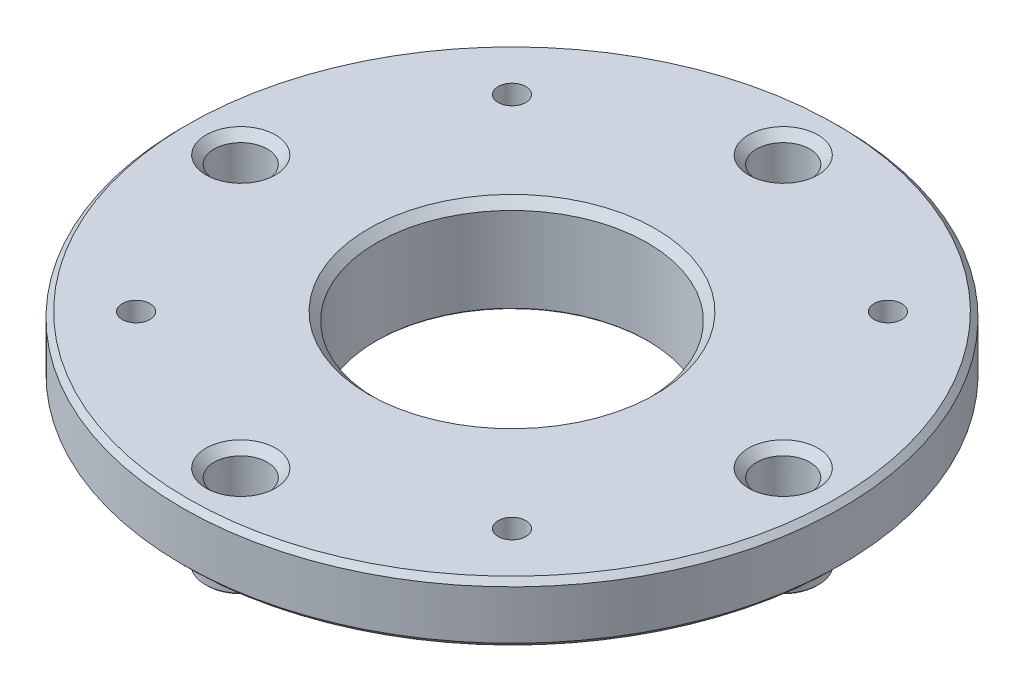
ISO-10303-21;
HEADER;
FILE_DESCRIPTION(('STEP AP214'),'2;1');
FILE_NAME('part.step','',(''),(''),'','','');
FILE_SCHEMA(('AUTOMOTIVE_DESIGN { 1 0 10303 214 1 1 1 1 }'));
ENDSEC;
DATA;
#1=APPLICATION_CONTEXT('core data for automotive mechanical design processes');
#2=APPLICATION_PROTOCOL_DEFINITION('international standard','automotive_design',2000,#1);
#3=PRODUCT_CONTEXT('',#1,'mechanical');
#4=PRODUCT('Part','Part','',(#3));
#5=PRODUCT_RELATED_PRODUCT_CATEGORY('part','',(#4));
#6=PRODUCT_DEFINITION_FORMATION('','',#4);
#7=PRODUCT_DEFINITION_CONTEXT('part definition',#1,'design');
#8=PRODUCT_DEFINITION('design','',#6,#7);
#9=PRODUCT_DEFINITION_SHAPE('','',#8);
#10=(LENGTH_UNIT() NAMED_UNIT(*) SI_UNIT(.MILLI.,.METRE.));
#11=(NAMED_UNIT(*) PLANE_ANGLE_UNIT() SI_UNIT($,.RADIAN.));
#12=(NAMED_UNIT(*) SI_UNIT($,.STERADIAN.) SOLID_ANGLE_UNIT());
#13=UNCERTAINTY_MEASURE_WITH_UNIT(LENGTH_MEASURE(1.E-05),#10,'distance_accuracy_value','');
#14=(GEOMETRIC_REPRESENTATION_CONTEXT(3) GLOBAL_UNCERTAINTY_ASSIGNED_CONTEXT((#13)) GLOBAL_UNIT_ASSIGNED_CONTEXT((#10,
#11,#12)) REPRESENTATION_CONTEXT('',''));
#15=CARTESIAN_POINT('',(0.,0.,0.));
#16=DIRECTION('',(0.,0.,1.));
#17=DIRECTION('',(1.,0.,0.));
#18=AXIS2_PLACEMENT_3D('',#15,#16,#17);
#19=CARTESIAN_POINT('',(0.,11.,0.));
#20=DIRECTION('',(0.,-1.,0.));
#21=DIRECTION('',(0.,0.,-1.));
#22=AXIS2_PLACEMENT_3D('',#19,#20,#21);
#23=CYLINDRICAL_SURFACE('',#22,60.75);
#24=CARTESIAN_POINT('',(0.,10.,0.));
#25=DIRECTION('',(0.,1.,0.));
#26=DIRECTION('',(0.,0.,1.));
#27=AXIS2_PLACEMENT_3D('',#24,#25,#26);
#28=CIRCLE('',#27,60.75);
#29=CARTESIAN_POINT('',(0.,10.,60.75));
#30=VERTEX_POINT('',#29);
#31=EDGE_CURVE('E110',#30,#30,#28,.F.);
#32=ORIENTED_EDGE('',*,*,#31,.T.);
#33=EDGE_LOOP('',(#32));
#34=FACE_BOUND('',#33,.T.);
#35=CARTESIAN_POINT('',(0.,0.999999999999994,0.));
#36=DIRECTION('',(0.,-1.,0.));
#37=DIRECTION('',(0.,0.,-1.));
#38=AXIS2_PLACEMENT_3D('',#35,#36,#37);
#39=CIRCLE('',#38,60.75);
#40=CARTESIAN_POINT('',(0.,0.999999999999994,-60.75));
#41=VERTEX_POINT('',#40);
#42=EDGE_CURVE('E114',#41,#41,#39,.F.);
#43=ORIENTED_EDGE('',*,*,#42,.T.);
#44=EDGE_LOOP('',(#43));
#45=FACE_BOUND('',#44,.T.);
#46=ADVANCED_FACE('F45',(#34,#45),#23,.T.);
#47=CARTESIAN_POINT('',(60.75,11.,0.));
#48=DIRECTION('',(0.,1.,0.));
#49=DIRECTION('',(0.,0.,1.));
#50=AXIS2_PLACEMENT_3D('',#47,#48,#49);
#51=PLANE('',#50);
#52=CARTESIAN_POINT('',(0.,11.,-50.));
#53=DIRECTION('',(0.,1.,0.));
#54=DIRECTION('',(0.,0.,1.));
#55=AXIS2_PLACEMENT_3D('',#52,#53,#54);
#56=CIRCLE('',#55,6.40219999999998);
#57=CARTESIAN_POINT('',(0.,11.,-43.5978));
#58=VERTEX_POINT('',#57);
#59=EDGE_CURVE('E74',#58,#58,#56,.F.);
#60=ORIENTED_EDGE('',*,*,#59,.T.);
#61=EDGE_LOOP('',(#60));
#62=FACE_BOUND('',#61,.T.);
#63=CARTESIAN_POINT('',(50.,11.,0.));
#64=DIRECTION('',(0.,1.,0.));
#65=DIRECTION('',(0.,0.,1.));
#66=AXIS2_PLACEMENT_3D('',#63,#64,#65);
#67=CIRCLE('',#66,6.40220000000002);
#68=CARTESIAN_POINT('',(50.,11.,6.40220000000002));
#69=VERTEX_POINT('',#68);
#70=EDGE_CURVE('E78',#69,#69,#67,.F.);
#71=ORIENTED_EDGE('',*,*,#70,.T.);
#72=EDGE_LOOP('',(#71));
#73=FACE_BOUND('',#72,.T.);
#74=CARTESIAN_POINT('',(0.,11.,0.));
#75=DIRECTION('',(0.,1.,0.));
#76=DIRECTION('',(0.,0.,1.));
#77=AXIS2_PLACEMENT_3D('',#74,#75,#76);
#78=CIRCLE('',#77,26.4555);
#79=CARTESIAN_POINT('',(0.,11.,26.4555));
#80=VERTEX_POINT('',#79);
#81=EDGE_CURVE('E82',#80,#80,#78,.F.);
#82=ORIENTED_EDGE('',*,*,#81,.T.);
#83=EDGE_LOOP('',(#82));
#84=FACE_BOUND('',#83,.T.);
#85=CARTESIAN_POINT('',(0.,11.,50.));
#86=DIRECTION('',(0.,1.,0.));
#87=DIRECTION('',(0.,0.,1.));
#88=AXIS2_PLACEMENT_3D('',#85,#86,#87);
#89=CIRCLE('',#88,6.40219999999994);
#90=CARTESIAN_POINT('',(0.,11.,56.4021999999999));
#91=VERTEX_POINT('',#90);
#92=EDGE_CURVE('E86',#91,#91,#89,.F.);
#93=ORIENTED_EDGE('',*,*,#92,.T.);
#94=EDGE_LOOP('',(#93));
#95=FACE_BOUND('',#94,.T.);
#96=CARTESIAN_POINT('',(-50.,11.,0.));
#97=DIRECTION('',(0.,1.,0.));
#98=DIRECTION('',(0.,0.,1.));
#99=AXIS2_PLACEMENT_3D('',#96,#97,#98);
#100=CIRCLE('',#99,6.40219999999994);
#101=CARTESIAN_POINT('',(-50.,11.,6.40219999999995));
#102=VERTEX_POINT('',#101);
#103=EDGE_CURVE('E90',#102,#102,#100,.F.);
#104=ORIENTED_EDGE('',*,*,#103,.T.);
#105=EDGE_LOOP('',(#104));
#106=FACE_BOUND('',#105,.T.);
#107=CARTESIAN_POINT('',(0.,11.,0.));
#108=DIRECTION('',(0.,1.,0.));
#109=DIRECTION('',(0.,0.,1.));
#110=AXIS2_PLACEMENT_3D('',#107,#108,#109);
#111=CIRCLE('',#110,59.75);
#112=CARTESIAN_POINT('',(0.,11.,59.75));
#113=VERTEX_POINT('',#112);
#114=EDGE_CURVE('E106',#113,#113,#111,.T.);
#115=ORIENTED_EDGE('',*,*,#114,.T.);
#116=EDGE_LOOP('',(#115));
#117=FACE_BOUND('',#116,.T.);
#118=CARTESIAN_POINT('',(-34.6482322781409,11.,34.6482322781407));
#119=DIRECTION('',(0.,1.,0.));
#120=DIRECTION('',(0.,0.,1.));
#121=AXIS2_PLACEMENT_3D('',#118,#119,#120);
#122=CIRCLE('',#121,2.55270000000001);
#123=CARTESIAN_POINT('',(-34.6482322781409,11.,37.2009322781408));
#124=VERTEX_POINT('',#123);
#125=EDGE_CURVE('E196',#124,#124,#122,.T.);
#126=ORIENTED_EDGE('',*,*,#125,.F.);
#127=EDGE_LOOP('',(#126));
#128=FACE_BOUND('',#127,.T.);
#129=CARTESIAN_POINT('',(34.6482322781407,11.,34.6482322781409));
#130=DIRECTION('',(0.,1.,0.));
#131=DIRECTION('',(0.,0.,1.));
#132=AXIS2_PLACEMENT_3D('',#129,#130,#131);
#133=CIRCLE('',#132,2.55270000000001);
#134=CARTESIAN_POINT('',(34.6482322781407,11.,37.2009322781409));
#135=VERTEX_POINT('',#134);
#136=EDGE_CURVE('E195',#135,#135,#133,.T.);
#137=ORIENTED_EDGE('',*,*,#136,.F.);
#138=EDGE_LOOP('',(#137));
#139=FACE_BOUND('',#138,.T.);
#140=CARTESIAN_POINT('',(34.6482322781409,11.,-34.6482322781407));
#141=DIRECTION('',(0.,1.,0.));
#142=DIRECTION('',(0.,0.,1.));
#143=AXIS2_PLACEMENT_3D('',#140,#141,#142);
#144=CIRCLE('',#143,2.55270000000001);
#145=CARTESIAN_POINT('',(34.6482322781409,11.,-32.0955322781407));
#146=VERTEX_POINT('',#145);
#147=EDGE_CURVE('E201',#146,#146,#144,.T.);
#148=ORIENTED_EDGE('',*,*,#147,.F.);
#149=EDGE_LOOP('',(#148));
#150=FACE_BOUND('',#149,.T.);
#151=CARTESIAN_POINT('',(-34.6482322781407,11.,-34.6482322781409));
#152=DIRECTION('',(0.,1.,0.));
#153=DIRECTION('',(0.,0.,1.));
#154=AXIS2_PLACEMENT_3D('',#151,#152,#153);
#155=CIRCLE('',#154,2.55270000000001);
#156=CARTESIAN_POINT('',(-34.6482322781407,11.,-32.0955322781409));
#157=VERTEX_POINT('',#156);
#158=EDGE_CURVE('E206',#157,#157,#155,.T.);
#159=ORIENTED_EDGE('',*,*,#158,.F.);
#160=EDGE_LOOP('',(#159));
#161=FACE_BOUND('',#160,.T.);
#162=ADVANCED_FACE('F245',(#62,#73,#84,#95,#106,#117,#128,#139,#150,#161),#51,.T.);
#163=CARTESIAN_POINT('',(0.,0.,0.));
#164=DIRECTION('',(0.,-1.,0.));
#165=DIRECTION('',(0.,0.,-1.));
#166=AXIS2_PLACEMENT_3D('',#163,#164,#165);
#167=PLANE('',#166);
#168=CARTESIAN_POINT('',(0.,0.,0.));
#169=DIRECTION('',(0.,-1.,0.));
#170=DIRECTION('',(0.,0.,-1.));
#171=AXIS2_PLACEMENT_3D('',#168,#169,#170);
#172=CIRCLE('',#171,59.75);
#173=CARTESIAN_POINT('',(0.,0.,-59.75));
#174=VERTEX_POINT('',#173);
#175=EDGE_CURVE('E102',#174,#174,#172,.T.);
#176=ORIENTED_EDGE('',*,*,#175,.T.);
#177=EDGE_LOOP('',(#176));
#178=FACE_BOUND('',#177,.T.);
#179=CARTESIAN_POINT('',(-34.6482322781409,0.,34.6482322781407));
#180=DIRECTION('',(0.,-1.,0.));
#181=DIRECTION('',(0.,0.,-1.));
#182=AXIS2_PLACEMENT_3D('',#179,#180,#181);
#183=CIRCLE('',#182,2.55270000000001);
#184=CARTESIAN_POINT('',(-34.6482322781409,0.,32.0955322781407));
#185=VERTEX_POINT('',#184);
#186=EDGE_CURVE('E191',#185,#185,#183,.T.);
#187=ORIENTED_EDGE('',*,*,#186,.F.);
#188=EDGE_LOOP('',(#187));
#189=FACE_BOUND('',#188,.T.);
#190=CARTESIAN_POINT('',(34.6482322781407,0.,34.6482322781409));
#191=DIRECTION('',(0.,-1.,0.));
#192=DIRECTION('',(0.,0.,-1.));
#193=AXIS2_PLACEMENT_3D('',#190,#191,#192);
#194=CIRCLE('',#193,2.55270000000001);
#195=CARTESIAN_POINT('',(34.6482322781407,0.,32.0955322781409));
#196=VERTEX_POINT('',#195);
#197=EDGE_CURVE('E197',#196,#196,#194,.T.);
#198=ORIENTED_EDGE('',*,*,#197,.F.);
#199=EDGE_LOOP('',(#198));
#200=FACE_BOUND('',#199,.T.);
#201=CARTESIAN_POINT('',(34.6482322781409,0.,-34.6482322781407));
#202=DIRECTION('',(0.,-1.,0.));
#203=DIRECTION('',(0.,0.,-1.));
#204=AXIS2_PLACEMENT_3D('',#201,#202,#203);
#205=CIRCLE('',#204,2.55270000000001);
#206=CARTESIAN_POINT('',(34.6482322781409,0.,-37.2009322781408));
#207=VERTEX_POINT('',#206);
#208=EDGE_CURVE('E202',#207,#207,#205,.T.);
#209=ORIENTED_EDGE('',*,*,#208,.F.);
#210=EDGE_LOOP('',(#209));
#211=FACE_BOUND('',#210,.T.);
#212=CARTESIAN_POINT('',(-34.6482322781407,0.,-34.6482322781409));
#213=DIRECTION('',(0.,-1.,0.));
#214=DIRECTION('',(0.,0.,-1.));
#215=AXIS2_PLACEMENT_3D('',#212,#213,#214);
#216=CIRCLE('',#215,2.55270000000001);
#217=CARTESIAN_POINT('',(-34.6482322781407,0.,-37.2009322781409));
#218=VERTEX_POINT('',#217);
#219=EDGE_CURVE('E226',#218,#218,#216,.T.);
#220=ORIENTED_EDGE('',*,*,#219,.F.);
#221=EDGE_LOOP('',(#220));
#222=FACE_BOUND('',#221,.T.);
#223=CARTESIAN_POINT('',(0.,0.,50.));
#224=DIRECTION('',(0.,-1.,0.));
#225=DIRECTION('',(0.,0.,-1.));
#226=AXIS2_PLACEMENT_3D('',#223,#224,#225);
#227=CIRCLE('',#226,6.475);
#228=CARTESIAN_POINT('',(0.,0.,43.525));
#229=VERTEX_POINT('',#228);
#230=EDGE_CURVE('E190',#229,#229,#227,.T.);
#231=ORIENTED_EDGE('',*,*,#230,.F.);
#232=EDGE_LOOP('',(#231));
#233=FACE_BOUND('',#232,.T.);
#234=CARTESIAN_POINT('',(50.,0.,0.));
#235=DIRECTION('',(0.,-1.,0.));
#236=DIRECTION('',(0.,0.,-1.));
#237=AXIS2_PLACEMENT_3D('',#234,#235,#236);
#238=CIRCLE('',#237,6.475);
#239=CARTESIAN_POINT('',(50.,0.,-6.475));
#240=VERTEX_POINT('',#239);
#241=EDGE_CURVE('E210',#240,#240,#238,.T.);
#242=ORIENTED_EDGE('',*,*,#241,.F.);
#243=EDGE_LOOP('',(#242));
#244=FACE_BOUND('',#243,.T.);
#245=CARTESIAN_POINT('',(0.,0.,-50.));
#246=DIRECTION('',(0.,-1.,0.));
#247=DIRECTION('',(0.,0.,-1.));
#248=AXIS2_PLACEMENT_3D('',#245,#246,#247);
#249=CIRCLE('',#248,6.475);
#250=CARTESIAN_POINT('',(0.,0.,-56.475));
#251=VERTEX_POINT('',#250);
#252=EDGE_CURVE('E214',#251,#251,#249,.T.);
#253=ORIENTED_EDGE('',*,*,#252,.F.);
#254=EDGE_LOOP('',(#253));
#255=FACE_BOUND('',#254,.T.);
#256=CARTESIAN_POINT('',(-50.,0.,0.));
#257=DIRECTION('',(0.,-1.,0.));
#258=DIRECTION('',(0.,0.,-1.));
#259=AXIS2_PLACEMENT_3D('',#256,#257,#258);
#260=CIRCLE('',#259,6.475);
#261=CARTESIAN_POINT('',(-50.,0.,-6.475));
#262=VERTEX_POINT('',#261);
#263=EDGE_CURVE('E218',#262,#262,#260,.T.);
#264=ORIENTED_EDGE('',*,*,#263,.F.);
#265=EDGE_LOOP('',(#264));
#266=FACE_BOUND('',#265,.T.);
#267=CARTESIAN_POINT('',(0.,0.,0.));
#268=DIRECTION('',(0.,-1.,0.));
#269=DIRECTION('',(0.,0.,-1.));
#270=AXIS2_PLACEMENT_3D('',#267,#268,#269);
#271=CIRCLE('',#270,28.485);
#272=CARTESIAN_POINT('',(0.,0.,-28.485));
#273=VERTEX_POINT('',#272);
#274=EDGE_CURVE('E222',#273,#273,#271,.T.);
#275=ORIENTED_EDGE('',*,*,#274,.F.);
#276=EDGE_LOOP('',(#275));
#277=FACE_BOUND('',#276,.T.);
#278=ADVANCED_FACE('F248',(#178,#189,#200,#211,#222,#233,#244,#255,#266,#277),#167,.T.);
#279=CARTESIAN_POINT('',(0.,-6.35,0.));
#280=DIRECTION('',(0.,1.,0.));
#281=DIRECTION('',(0.,0.,1.));
#282=AXIS2_PLACEMENT_3D('',#279,#280,#281);
#283=CYLINDRICAL_SURFACE('',#282,28.485);
#284=CARTESIAN_POINT('',(0.,-5.34999999999997,0.));
#285=DIRECTION('',(0.,-1.,0.));
#286=DIRECTION('',(0.,0.,-1.));
#287=AXIS2_PLACEMENT_3D('',#284,#285,#286);
#288=CIRCLE('',#287,28.485);
#289=CARTESIAN_POINT('',(0.,-5.34999999999997,-28.485));
#290=VERTEX_POINT('',#289);
#291=EDGE_CURVE('E94',#290,#290,#288,.F.);
#292=ORIENTED_EDGE('',*,*,#291,.T.);
#293=EDGE_LOOP('',(#292));
#294=FACE_BOUND('',#293,.T.);
#295=ORIENTED_EDGE('',*,*,#274,.T.);
#296=EDGE_LOOP('',(#295));
#297=FACE_BOUND('',#296,.T.);
#298=ADVANCED_FACE('F664',(#294,#297),#283,.T.);
#299=CARTESIAN_POINT('',(0.,-6.35,0.));
#300=DIRECTION('',(0.,-1.,0.));
#301=DIRECTION('',(0.,0.,-1.));
#302=AXIS2_PLACEMENT_3D('',#299,#300,#301);
#303=PLANE('',#302);
#304=CARTESIAN_POINT('',(0.,-6.35,0.));
#305=DIRECTION('',(0.,-1.,0.));
#306=DIRECTION('',(0.,0.,-1.));
#307=AXIS2_PLACEMENT_3D('',#304,#305,#306);
#308=CIRCLE('',#307,27.485);
#309=CARTESIAN_POINT('',(0.,-6.35,-27.485));
#310=VERTEX_POINT('',#309);
#311=EDGE_CURVE('E98',#310,#310,#308,.T.);
#312=ORIENTED_EDGE('',*,*,#311,.T.);
#313=EDGE_LOOP('',(#312));
#314=FACE_BOUND('',#313,.T.);
#315=CARTESIAN_POINT('',(0.,-6.35,0.));
#316=DIRECTION('',(0.,-1.,0.));
#317=DIRECTION('',(0.,0.,-1.));
#318=AXIS2_PLACEMENT_3D('',#315,#316,#317);
#319=CIRCLE('',#318,25.2055);
#320=CARTESIAN_POINT('',(0.,-6.35,-25.2055));
#321=VERTEX_POINT('',#320);
#322=EDGE_CURVE('E186',#321,#321,#319,.F.);
#323=ORIENTED_EDGE('',*,*,#322,.T.);
#324=EDGE_LOOP('',(#323));
#325=FACE_BOUND('',#324,.T.);
#326=ADVANCED_FACE('F655',(#314,#325),#303,.T.);
#327=CARTESIAN_POINT('',(-50.,-4.65,0.));
#328=DIRECTION('',(0.,1.,0.));
#329=DIRECTION('',(0.,0.,1.));
#330=AXIS2_PLACEMENT_3D('',#327,#328,#329);
#331=CYLINDRICAL_SURFACE('',#330,6.475);
#332=CARTESIAN_POINT('',(-50.,-4.40000000000001,0.));
#333=DIRECTION('',(0.,-1.,0.));
#334=DIRECTION('',(0.,0.,-1.));
#335=AXIS2_PLACEMENT_3D('',#332,#333,#334);
#336=CIRCLE('',#335,6.475);
#337=CARTESIAN_POINT('',(-50.,-4.40000000000001,-6.475));
#338=VERTEX_POINT('',#337);
#339=EDGE_CURVE('E142',#338,#338,#336,.F.);
#340=ORIENTED_EDGE('',*,*,#339,.T.);
#341=EDGE_LOOP('',(#340));
#342=FACE_BOUND('',#341,.T.);
#343=ORIENTED_EDGE('',*,*,#263,.T.);
#344=EDGE_LOOP('',(#343));
#345=FACE_BOUND('',#344,.T.);
#346=ADVANCED_FACE('F646',(#342,#345),#331,.T.);
#347=CARTESIAN_POINT('',(-43.525,-4.65,0.));
#348=DIRECTION('',(0.,-1.,0.));
#349=DIRECTION('',(0.,0.,-1.));
#350=AXIS2_PLACEMENT_3D('',#347,#348,#349);
#351=PLANE('',#350);
#352=CARTESIAN_POINT('',(-50.,-4.65,0.));
#353=DIRECTION('',(0.,-1.,0.));
#354=DIRECTION('',(0.,0.,-1.));
#355=AXIS2_PLACEMENT_3D('',#352,#353,#354);
#356=CIRCLE('',#355,5.15220000000001);
#357=CARTESIAN_POINT('',(-50.,-4.65,-5.1522));
#358=VERTEX_POINT('',#357);
#359=EDGE_CURVE('E158',#358,#358,#356,.F.);
#360=ORIENTED_EDGE('',*,*,#359,.T.);
#361=EDGE_LOOP('',(#360));
#362=FACE_BOUND('',#361,.T.);
#363=CARTESIAN_POINT('',(-50.,-4.65,0.));
#364=DIRECTION('',(0.,-1.,0.));
#365=DIRECTION('',(0.,0.,-1.));
#366=AXIS2_PLACEMENT_3D('',#363,#364,#365);
#367=CIRCLE('',#366,6.22499999999998);
#368=CARTESIAN_POINT('',(-50.,-4.65,-6.22499999999998));
#369=VERTEX_POINT('',#368);
#370=EDGE_CURVE('E162',#369,#369,#367,.T.);
#371=ORIENTED_EDGE('',*,*,#370,.T.);
#372=EDGE_LOOP('',(#371));
#373=FACE_BOUND('',#372,.T.);
#374=ADVANCED_FACE('F636',(#362,#373),#351,.T.);
#375=CARTESIAN_POINT('',(0.,-4.65,-50.));
#376=DIRECTION('',(0.,1.,0.));
#377=DIRECTION('',(0.,0.,1.));
#378=AXIS2_PLACEMENT_3D('',#375,#376,#377);
#379=CYLINDRICAL_SURFACE('',#378,6.475);
#380=CARTESIAN_POINT('',(0.,-4.40000000000002,-50.));
#381=DIRECTION('',(0.,-1.,0.));
#382=DIRECTION('',(0.,0.,-1.));
#383=AXIS2_PLACEMENT_3D('',#380,#381,#382);
#384=CIRCLE('',#383,6.475);
#385=CARTESIAN_POINT('',(0.,-4.40000000000002,-56.475));
#386=VERTEX_POINT('',#385);
#387=EDGE_CURVE('E118',#386,#386,#384,.F.);
#388=ORIENTED_EDGE('',*,*,#387,.T.);
#389=EDGE_LOOP('',(#388));
#390=FACE_BOUND('',#389,.T.);
#391=ORIENTED_EDGE('',*,*,#252,.T.);
#392=EDGE_LOOP('',(#391));
#393=FACE_BOUND('',#392,.T.);
#394=ADVANCED_FACE('F626',(#390,#393),#379,.T.);
#395=CARTESIAN_POINT('',(6.475,-4.65,-50.));
#396=DIRECTION('',(0.,-1.,0.));
#397=DIRECTION('',(0.,0.,-1.));
#398=AXIS2_PLACEMENT_3D('',#395,#396,#397);
#399=PLANE('',#398);
#400=CARTESIAN_POINT('',(0.,-4.65,-50.));
#401=DIRECTION('',(0.,-1.,0.));
#402=DIRECTION('',(0.,0.,-1.));
#403=AXIS2_PLACEMENT_3D('',#400,#401,#402);
#404=CIRCLE('',#403,5.15219999999998);
#405=CARTESIAN_POINT('',(0.,-4.65,-55.1522));
#406=VERTEX_POINT('',#405);
#407=EDGE_CURVE('E122',#406,#406,#404,.F.);
#408=ORIENTED_EDGE('',*,*,#407,.T.);
#409=EDGE_LOOP('',(#408));
#410=FACE_BOUND('',#409,.T.);
#411=CARTESIAN_POINT('',(0.,-4.65,-50.));
#412=DIRECTION('',(0.,-1.,0.));
#413=DIRECTION('',(0.,0.,-1.));
#414=AXIS2_PLACEMENT_3D('',#411,#412,#413);
#415=CIRCLE('',#414,6.22499999999999);
#416=CARTESIAN_POINT('',(0.,-4.65,-56.225));
#417=VERTEX_POINT('',#416);
#418=EDGE_CURVE('E126',#417,#417,#415,.T.);
#419=ORIENTED_EDGE('',*,*,#418,.T.);
#420=EDGE_LOOP('',(#419));
#421=FACE_BOUND('',#420,.T.);
#422=ADVANCED_FACE('F616',(#410,#421),#399,.T.);
#423=CARTESIAN_POINT('',(50.,-4.65,0.));
#424=DIRECTION('',(0.,1.,0.));
#425=DIRECTION('',(0.,0.,1.));
#426=AXIS2_PLACEMENT_3D('',#423,#424,#425);
#427=CYLINDRICAL_SURFACE('',#426,6.475);
#428=CARTESIAN_POINT('',(50.,-4.40000000000001,0.));
#429=DIRECTION('',(0.,-1.,0.));
#430=DIRECTION('',(0.,0.,-1.));
#431=AXIS2_PLACEMENT_3D('',#428,#429,#430);
#432=CIRCLE('',#431,6.475);
#433=CARTESIAN_POINT('',(50.,-4.40000000000001,-6.475));
#434=VERTEX_POINT('',#433);
#435=EDGE_CURVE('E134',#434,#434,#432,.F.);
#436=ORIENTED_EDGE('',*,*,#435,.T.);
#437=EDGE_LOOP('',(#436));
#438=FACE_BOUND('',#437,.T.);
#439=ORIENTED_EDGE('',*,*,#241,.T.);
#440=EDGE_LOOP('',(#439));
#441=FACE_BOUND('',#440,.T.);
#442=ADVANCED_FACE('F606',(#438,#441),#427,.T.);
#443=CARTESIAN_POINT('',(56.475,-4.65,0.));
#444=DIRECTION('',(0.,-1.,0.));
#445=DIRECTION('',(0.,0.,-1.));
#446=AXIS2_PLACEMENT_3D('',#443,#444,#445);
#447=PLANE('',#446);
#448=CARTESIAN_POINT('',(50.,-4.65,0.));
#449=DIRECTION('',(0.,-1.,0.));
#450=DIRECTION('',(0.,0.,-1.));
#451=AXIS2_PLACEMENT_3D('',#448,#449,#450);
#452=CIRCLE('',#451,5.15219999999998);
#453=CARTESIAN_POINT('',(50.,-4.65,-5.15219999999999));
#454=VERTEX_POINT('',#453);
#455=EDGE_CURVE('E146',#454,#454,#452,.F.);
#456=ORIENTED_EDGE('',*,*,#455,.T.);
#457=EDGE_LOOP('',(#456));
#458=FACE_BOUND('',#457,.T.);
#459=CARTESIAN_POINT('',(50.,-4.65,0.));
#460=DIRECTION('',(0.,-1.,0.));
#461=DIRECTION('',(0.,0.,-1.));
#462=AXIS2_PLACEMENT_3D('',#459,#460,#461);
#463=CIRCLE('',#462,6.22499999999998);
#464=CARTESIAN_POINT('',(50.,-4.65,-6.22499999999998));
#465=VERTEX_POINT('',#464);
#466=EDGE_CURVE('E150',#465,#465,#463,.T.);
#467=ORIENTED_EDGE('',*,*,#466,.T.);
#468=EDGE_LOOP('',(#467));
#469=FACE_BOUND('',#468,.T.);
#470=ADVANCED_FACE('F596',(#458,#469),#447,.T.);
#471=CARTESIAN_POINT('',(0.,-4.65,50.));
#472=DIRECTION('',(0.,1.,0.));
#473=DIRECTION('',(0.,0.,1.));
#474=AXIS2_PLACEMENT_3D('',#471,#472,#473);
#475=CYLINDRICAL_SURFACE('',#474,6.475);
#476=CARTESIAN_POINT('',(0.,-4.40000000000002,50.));
#477=DIRECTION('',(0.,-1.,0.));
#478=DIRECTION('',(0.,0.,-1.));
#479=AXIS2_PLACEMENT_3D('',#476,#477,#478);
#480=CIRCLE('',#479,6.475);
#481=CARTESIAN_POINT('',(0.,-4.40000000000002,43.525));
#482=VERTEX_POINT('',#481);
#483=EDGE_CURVE('E138',#482,#482,#480,.F.);
#484=ORIENTED_EDGE('',*,*,#483,.T.);
#485=EDGE_LOOP('',(#484));
#486=FACE_BOUND('',#485,.T.);
#487=ORIENTED_EDGE('',*,*,#230,.T.);
#488=EDGE_LOOP('',(#487));
#489=FACE_BOUND('',#488,.T.);
#490=ADVANCED_FACE('F270',(#486,#489),#475,.T.);
#491=CARTESIAN_POINT('',(6.47500000000001,-4.65,50.));
#492=DIRECTION('',(0.,-1.,0.));
#493=DIRECTION('',(0.,0.,-1.));
#494=AXIS2_PLACEMENT_3D('',#491,#492,#493);
#495=PLANE('',#494);
#496=CARTESIAN_POINT('',(0.,-4.65,50.));
#497=DIRECTION('',(0.,-1.,0.));
#498=DIRECTION('',(0.,0.,-1.));
#499=AXIS2_PLACEMENT_3D('',#496,#497,#498);
#500=CIRCLE('',#499,5.15219999999998);
#501=CARTESIAN_POINT('',(0.,-4.65,44.8478));
#502=VERTEX_POINT('',#501);
#503=EDGE_CURVE('E170',#502,#502,#500,.F.);
#504=ORIENTED_EDGE('',*,*,#503,.T.);
#505=EDGE_LOOP('',(#504));
#506=FACE_BOUND('',#505,.T.);
#507=CARTESIAN_POINT('',(0.,-4.65,50.));
#508=DIRECTION('',(0.,-1.,0.));
#509=DIRECTION('',(0.,0.,-1.));
#510=AXIS2_PLACEMENT_3D('',#507,#508,#509);
#511=CIRCLE('',#510,6.22499999999999);
#512=CARTESIAN_POINT('',(0.,-4.65,43.775));
#513=VERTEX_POINT('',#512);
#514=EDGE_CURVE('E174',#513,#513,#511,.T.);
#515=ORIENTED_EDGE('',*,*,#514,.T.);
#516=EDGE_LOOP('',(#515));
#517=FACE_BOUND('',#516,.T.);
#518=ADVANCED_FACE('F260',(#506,#517),#495,.T.);
#519=CARTESIAN_POINT('',(-34.6482322781407,11.,-34.6482322781409));
#520=DIRECTION('',(0.,1.,0.));
#521=DIRECTION('',(0.,0.,1.));
#522=AXIS2_PLACEMENT_3D('',#519,#520,#521);
#523=CYLINDRICAL_SURFACE('',#522,2.55270000000001);
#524=ORIENTED_EDGE('',*,*,#219,.T.);
#525=EDGE_LOOP('',(#524));
#526=FACE_BOUND('',#525,.T.);
#527=ORIENTED_EDGE('',*,*,#158,.T.);
#528=EDGE_LOOP('',(#527));
#529=FACE_BOUND('',#528,.T.);
#530=ADVANCED_FACE('F257',(#526,#529),#523,.F.);
#531=CARTESIAN_POINT('',(34.6482322781409,11.,-34.6482322781407));
#532=DIRECTION('',(0.,1.,0.));
#533=DIRECTION('',(0.,0.,1.));
#534=AXIS2_PLACEMENT_3D('',#531,#532,#533);
#535=CYLINDRICAL_SURFACE('',#534,2.55270000000001);
#536=ORIENTED_EDGE('',*,*,#208,.T.);
#537=EDGE_LOOP('',(#536));
#538=FACE_BOUND('',#537,.T.);
#539=ORIENTED_EDGE('',*,*,#147,.T.);
#540=EDGE_LOOP('',(#539));
#541=FACE_BOUND('',#540,.T.);
#542=ADVANCED_FACE('F259',(#538,#541),#535,.F.);
#543=CARTESIAN_POINT('',(34.6482322781407,11.,34.6482322781409));
#544=DIRECTION('',(0.,1.,0.));
#545=DIRECTION('',(0.,0.,1.));
#546=AXIS2_PLACEMENT_3D('',#543,#544,#545);
#547=CYLINDRICAL_SURFACE('',#546,2.55270000000001);
#548=ORIENTED_EDGE('',*,*,#197,.T.);
#549=EDGE_LOOP('',(#548));
#550=FACE_BOUND('',#549,.T.);
#551=ORIENTED_EDGE('',*,*,#136,.T.);
#552=EDGE_LOOP('',(#551));
#553=FACE_BOUND('',#552,.T.);
#554=ADVANCED_FACE('F266',(#550,#553),#547,.F.);
#555=CARTESIAN_POINT('',(-34.6482322781409,11.,34.6482322781407));
#556=DIRECTION('',(0.,1.,0.));
#557=DIRECTION('',(0.,0.,1.));
#558=AXIS2_PLACEMENT_3D('',#555,#556,#557);
#559=CYLINDRICAL_SURFACE('',#558,2.55270000000001);
#560=ORIENTED_EDGE('',*,*,#186,.T.);
#561=EDGE_LOOP('',(#560));
#562=FACE_BOUND('',#561,.T.);
#563=ORIENTED_EDGE('',*,*,#125,.T.);
#564=EDGE_LOOP('',(#563));
#565=FACE_BOUND('',#564,.T.);
#566=ADVANCED_FACE('F243',(#562,#565),#559,.F.);
#567=CARTESIAN_POINT('',(-50.,11.,0.));
#568=DIRECTION('',(0.,1.,0.));
#569=DIRECTION('',(0.,0.,1.));
#570=AXIS2_PLACEMENT_3D('',#567,#568,#569);
#571=CYLINDRICAL_SURFACE('',#570,4.90219999999999);
#572=CARTESIAN_POINT('',(-50.,9.50000000000006,0.));
#573=DIRECTION('',(0.,1.,0.));
#574=DIRECTION('',(0.,0.,1.));
#575=AXIS2_PLACEMENT_3D('',#572,#573,#574);
#576=CIRCLE('',#575,4.90219999999999);
#577=CARTESIAN_POINT('',(-50.,9.50000000000006,4.9022));
#578=VERTEX_POINT('',#577);
#579=EDGE_CURVE('E10',#578,#578,#576,.T.);
#580=ORIENTED_EDGE('',*,*,#579,.T.);
#581=EDGE_LOOP('',(#580));
#582=FACE_BOUND('',#581,.T.);
#583=CARTESIAN_POINT('',(-50.,-4.40000000000001,0.));
#584=DIRECTION('',(0.,-1.,0.));
#585=DIRECTION('',(0.,0.,-1.));
#586=AXIS2_PLACEMENT_3D('',#583,#584,#585);
#587=CIRCLE('',#586,4.90219999999999);
#588=CARTESIAN_POINT('',(-50.,-4.40000000000001,-4.90219999999998));
#589=VERTEX_POINT('',#588);
#590=EDGE_CURVE('E166',#589,#589,#587,.T.);
#591=ORIENTED_EDGE('',*,*,#590,.T.);
#592=EDGE_LOOP('',(#591));
#593=FACE_BOUND('',#592,.T.);
#594=ADVANCED_FACE('F544',(#582,#593),#571,.F.);
#595=CARTESIAN_POINT('',(0.,11.,50.));
#596=DIRECTION('',(0.,1.,0.));
#597=DIRECTION('',(0.,0.,1.));
#598=AXIS2_PLACEMENT_3D('',#595,#596,#597);
#599=CYLINDRICAL_SURFACE('',#598,4.90219999999999);
#600=CARTESIAN_POINT('',(0.,9.50000000000006,50.));
#601=DIRECTION('',(0.,1.,0.));
#602=DIRECTION('',(0.,0.,1.));
#603=AXIS2_PLACEMENT_3D('',#600,#601,#602);
#604=CIRCLE('',#603,4.90219999999999);
#605=CARTESIAN_POINT('',(0.,9.50000000000006,54.9022));
#606=VERTEX_POINT('',#605);
#607=EDGE_CURVE('E54',#606,#606,#604,.T.);
#608=ORIENTED_EDGE('',*,*,#607,.T.);
#609=EDGE_LOOP('',(#608));
#610=FACE_BOUND('',#609,.T.);
#611=CARTESIAN_POINT('',(0.,-4.40000000000003,50.));
#612=DIRECTION('',(0.,-1.,0.));
#613=DIRECTION('',(0.,0.,-1.));
#614=AXIS2_PLACEMENT_3D('',#611,#612,#613);
#615=CIRCLE('',#614,4.90219999999999);
#616=CARTESIAN_POINT('',(0.,-4.40000000000003,45.0978));
#617=VERTEX_POINT('',#616);
#618=EDGE_CURVE('E178',#617,#617,#615,.T.);
#619=ORIENTED_EDGE('',*,*,#618,.T.);
#620=EDGE_LOOP('',(#619));
#621=FACE_BOUND('',#620,.T.);
#622=ADVANCED_FACE('F534',(#610,#621),#599,.F.);
#623=CARTESIAN_POINT('',(50.,11.,0.));
#624=DIRECTION('',(0.,1.,0.));
#625=DIRECTION('',(0.,0.,1.));
#626=AXIS2_PLACEMENT_3D('',#623,#624,#625);
#627=CYLINDRICAL_SURFACE('',#626,4.90219999999999);
#628=CARTESIAN_POINT('',(50.,9.49999999999998,0.));
#629=DIRECTION('',(0.,1.,0.));
#630=DIRECTION('',(0.,0.,1.));
#631=AXIS2_PLACEMENT_3D('',#628,#629,#630);
#632=CIRCLE('',#631,4.90219999999999);
#633=CARTESIAN_POINT('',(50.,9.49999999999998,4.90219999999998));
#634=VERTEX_POINT('',#633);
#635=EDGE_CURVE('E64',#634,#634,#632,.T.);
#636=ORIENTED_EDGE('',*,*,#635,.T.);
#637=EDGE_LOOP('',(#636));
#638=FACE_BOUND('',#637,.T.);
#639=CARTESIAN_POINT('',(50.,-4.40000000000004,0.));
#640=DIRECTION('',(0.,-1.,0.));
#641=DIRECTION('',(0.,0.,-1.));
#642=AXIS2_PLACEMENT_3D('',#639,#640,#641);
#643=CIRCLE('',#642,4.90219999999999);
#644=CARTESIAN_POINT('',(50.,-4.40000000000004,-4.90219999999999));
#645=VERTEX_POINT('',#644);
#646=EDGE_CURVE('E154',#645,#645,#643,.T.);
#647=ORIENTED_EDGE('',*,*,#646,.T.);
#648=EDGE_LOOP('',(#647));
#649=FACE_BOUND('',#648,.T.);
#650=ADVANCED_FACE('F524',(#638,#649),#627,.F.);
#651=CARTESIAN_POINT('',(0.,11.,0.));
#652=DIRECTION('',(0.,1.,0.));
#653=DIRECTION('',(0.,0.,1.));
#654=AXIS2_PLACEMENT_3D('',#651,#652,#653);
#655=CYLINDRICAL_SURFACE('',#654,24.9555);
#656=CARTESIAN_POINT('',(0.,9.50000000000001,0.));
#657=DIRECTION('',(0.,1.,0.));
#658=DIRECTION('',(0.,0.,1.));
#659=AXIS2_PLACEMENT_3D('',#656,#657,#658);
#660=CIRCLE('',#659,24.9555);
#661=CARTESIAN_POINT('',(0.,9.50000000000001,24.9555));
#662=VERTEX_POINT('',#661);
#663=EDGE_CURVE('E59',#662,#662,#660,.T.);
#664=ORIENTED_EDGE('',*,*,#663,.T.);
#665=EDGE_LOOP('',(#664));
#666=FACE_BOUND('',#665,.T.);
#667=CARTESIAN_POINT('',(0.,-6.09999999999999,0.));
#668=DIRECTION('',(0.,-1.,0.));
#669=DIRECTION('',(0.,0.,-1.));
#670=AXIS2_PLACEMENT_3D('',#667,#668,#669);
#671=CIRCLE('',#670,24.9555);
#672=CARTESIAN_POINT('',(0.,-6.09999999999999,-24.9555));
#673=VERTEX_POINT('',#672);
#674=EDGE_CURVE('E182',#673,#673,#671,.T.);
#675=ORIENTED_EDGE('',*,*,#674,.T.);
#676=EDGE_LOOP('',(#675));
#677=FACE_BOUND('',#676,.T.);
#678=ADVANCED_FACE('F514',(#666,#677),#655,.F.);
#679=CARTESIAN_POINT('',(0.,-4.65,-50.));
#680=DIRECTION('',(0.,-1.,0.));
#681=DIRECTION('',(0.,0.,-1.));
#682=AXIS2_PLACEMENT_3D('',#679,#680,#681);
#683=CYLINDRICAL_SURFACE('',#682,4.90219999999999);
#684=CARTESIAN_POINT('',(0.,9.49999999999997,-50.));
#685=DIRECTION('',(0.,1.,0.));
#686=DIRECTION('',(0.,0.,1.));
#687=AXIS2_PLACEMENT_3D('',#684,#685,#686);
#688=CIRCLE('',#687,4.90219999999999);
#689=CARTESIAN_POINT('',(0.,9.49999999999997,-45.0978));
#690=VERTEX_POINT('',#689);
#691=EDGE_CURVE('E70',#690,#690,#688,.T.);
#692=ORIENTED_EDGE('',*,*,#691,.T.);
#693=EDGE_LOOP('',(#692));
#694=FACE_BOUND('',#693,.T.);
#695=CARTESIAN_POINT('',(0.,-4.40000000000004,-50.));
#696=DIRECTION('',(0.,-1.,0.));
#697=DIRECTION('',(0.,0.,-1.));
#698=AXIS2_PLACEMENT_3D('',#695,#696,#697);
#699=CIRCLE('',#698,4.90219999999999);
#700=CARTESIAN_POINT('',(0.,-4.40000000000004,-54.9022));
#701=VERTEX_POINT('',#700);
#702=EDGE_CURVE('E130',#701,#701,#699,.T.);
#703=ORIENTED_EDGE('',*,*,#702,.T.);
#704=EDGE_LOOP('',(#703));
#705=FACE_BOUND('',#704,.T.);
#706=ADVANCED_FACE('F291',(#694,#705),#683,.F.);
#707=CARTESIAN_POINT('',(0.,-6.35,0.));
#708=DIRECTION('',(0.,-1.,0.));
#709=DIRECTION('',(0.,0.,-1.));
#710=AXIS2_PLACEMENT_3D('',#707,#708,#709);
#711=CONICAL_SURFACE('',#710,25.2055,0.785398163397393);
#712=ORIENTED_EDGE('',*,*,#674,.F.);
#713=EDGE_LOOP('',(#712));
#714=FACE_BOUND('',#713,.T.);
#715=ORIENTED_EDGE('',*,*,#322,.F.);
#716=EDGE_LOOP('',(#715));
#717=FACE_BOUND('',#716,.T.);
#718=ADVANCED_FACE('F284',(#714,#717),#711,.F.);
#719=CARTESIAN_POINT('',(0.,-4.40000000000003,50.));
#720=DIRECTION('',(0.,-1.,0.));
#721=DIRECTION('',(0.,0.,-1.));
#722=AXIS2_PLACEMENT_3D('',#719,#720,#721);
#723=CONICAL_SURFACE('',#722,4.90219999999999,0.785398163397511);
#724=ORIENTED_EDGE('',*,*,#503,.F.);
#725=EDGE_LOOP('',(#724));
#726=FACE_BOUND('',#725,.T.);
#727=ORIENTED_EDGE('',*,*,#618,.F.);
#728=EDGE_LOOP('',(#727));
#729=FACE_BOUND('',#728,.T.);
#730=ADVANCED_FACE('F290',(#726,#729),#723,.F.);
#731=CARTESIAN_POINT('',(-50.,-4.40000000000001,0.));
#732=DIRECTION('',(0.,-1.,0.));
#733=DIRECTION('',(0.,0.,-1.));
#734=AXIS2_PLACEMENT_3D('',#731,#732,#733);
#735=CONICAL_SURFACE('',#734,4.90219999999999,0.785398163397511);
#736=ORIENTED_EDGE('',*,*,#359,.F.);
#737=EDGE_LOOP('',(#736));
#738=FACE_BOUND('',#737,.T.);
#739=ORIENTED_EDGE('',*,*,#590,.F.);
#740=EDGE_LOOP('',(#739));
#741=FACE_BOUND('',#740,.T.);
#742=ADVANCED_FACE('F298',(#738,#741),#735,.F.);
#743=CARTESIAN_POINT('',(50.,-4.40000000000004,0.));
#744=DIRECTION('',(0.,-1.,0.));
#745=DIRECTION('',(0.,0.,-1.));
#746=AXIS2_PLACEMENT_3D('',#743,#744,#745);
#747=CONICAL_SURFACE('',#746,4.90219999999999,0.785398163397511);
#748=ORIENTED_EDGE('',*,*,#455,.F.);
#749=EDGE_LOOP('',(#748));
#750=FACE_BOUND('',#749,.T.);
#751=ORIENTED_EDGE('',*,*,#646,.F.);
#752=EDGE_LOOP('',(#751));
#753=FACE_BOUND('',#752,.T.);
#754=ADVANCED_FACE('F305',(#750,#753),#747,.F.);
#755=CARTESIAN_POINT('',(-50.,-4.40000000000001,0.));
#756=DIRECTION('',(0.,1.,0.));
#757=DIRECTION('',(0.,0.,1.));
#758=AXIS2_PLACEMENT_3D('',#755,#756,#757);
#759=CONICAL_SURFACE('',#758,6.475,0.785398163397506);
#760=ORIENTED_EDGE('',*,*,#370,.F.);
#761=EDGE_LOOP('',(#760));
#762=FACE_BOUND('',#761,.T.);
#763=ORIENTED_EDGE('',*,*,#339,.F.);
#764=EDGE_LOOP('',(#763));
#765=FACE_BOUND('',#764,.T.);
#766=ADVANCED_FACE('F312',(#762,#765),#759,.T.);
#767=CARTESIAN_POINT('',(0.,-4.40000000000002,50.));
#768=DIRECTION('',(0.,1.,0.));
#769=DIRECTION('',(0.,0.,1.));
#770=AXIS2_PLACEMENT_3D('',#767,#768,#769);
#771=CONICAL_SURFACE('',#770,6.475,0.785398163397509);
#772=ORIENTED_EDGE('',*,*,#514,.F.);
#773=EDGE_LOOP('',(#772));
#774=FACE_BOUND('',#773,.T.);
#775=ORIENTED_EDGE('',*,*,#483,.F.);
#776=EDGE_LOOP('',(#775));
#777=FACE_BOUND('',#776,.T.);
#778=ADVANCED_FACE('F319',(#774,#777),#771,.T.);
#779=CARTESIAN_POINT('',(50.,-4.40000000000001,0.));
#780=DIRECTION('',(0.,1.,0.));
#781=DIRECTION('',(0.,0.,1.));
#782=AXIS2_PLACEMENT_3D('',#779,#780,#781);
#783=CONICAL_SURFACE('',#782,6.475,0.785398163397506);
#784=ORIENTED_EDGE('',*,*,#466,.F.);
#785=EDGE_LOOP('',(#784));
#786=FACE_BOUND('',#785,.T.);
#787=ORIENTED_EDGE('',*,*,#435,.F.);
#788=EDGE_LOOP('',(#787));
#789=FACE_BOUND('',#788,.T.);
#790=ADVANCED_FACE('F326',(#786,#789),#783,.T.);
#791=CARTESIAN_POINT('',(0.,-4.40000000000004,-50.));
#792=DIRECTION('',(0.,-1.,0.));
#793=DIRECTION('',(0.,0.,-1.));
#794=AXIS2_PLACEMENT_3D('',#791,#792,#793);
#795=CONICAL_SURFACE('',#794,4.90219999999999,0.785398163397507);
#796=ORIENTED_EDGE('',*,*,#407,.F.);
#797=EDGE_LOOP('',(#796));
#798=FACE_BOUND('',#797,.T.);
#799=ORIENTED_EDGE('',*,*,#702,.F.);
#800=EDGE_LOOP('',(#799));
#801=FACE_BOUND('',#800,.T.);
#802=ADVANCED_FACE('F333',(#798,#801),#795,.F.);
#803=CARTESIAN_POINT('',(0.,-4.40000000000002,-50.));
#804=DIRECTION('',(0.,1.,0.));
#805=DIRECTION('',(0.,0.,1.));
#806=AXIS2_PLACEMENT_3D('',#803,#804,#805);
#807=CONICAL_SURFACE('',#806,6.475,0.785398163397509);
#808=ORIENTED_EDGE('',*,*,#418,.F.);
#809=EDGE_LOOP('',(#808));
#810=FACE_BOUND('',#809,.T.);
#811=ORIENTED_EDGE('',*,*,#387,.F.);
#812=EDGE_LOOP('',(#811));
#813=FACE_BOUND('',#812,.T.);
#814=ADVANCED_FACE('F340',(#810,#813),#807,.T.);
#815=CARTESIAN_POINT('',(0.,10.,0.));
#816=DIRECTION('',(0.,-1.,0.));
#817=DIRECTION('',(0.,0.,-1.));
#818=AXIS2_PLACEMENT_3D('',#815,#816,#817);
#819=CONICAL_SURFACE('',#818,60.75,0.785398163397452);
#820=ORIENTED_EDGE('',*,*,#114,.F.);
#821=EDGE_LOOP('',(#820));
#822=FACE_BOUND('',#821,.T.);
#823=ORIENTED_EDGE('',*,*,#31,.F.);
#824=EDGE_LOOP('',(#823));
#825=FACE_BOUND('',#824,.T.);
#826=ADVANCED_FACE('F346',(#822,#825),#819,.T.);
#827=CARTESIAN_POINT('',(0.,0.,0.));
#828=DIRECTION('',(0.,1.,0.));
#829=DIRECTION('',(0.,0.,1.));
#830=AXIS2_PLACEMENT_3D('',#827,#828,#829);
#831=CONICAL_SURFACE('',#830,59.75,0.785398163397441);
#832=ORIENTED_EDGE('',*,*,#42,.F.);
#833=EDGE_LOOP('',(#832));
#834=FACE_BOUND('',#833,.T.);
#835=ORIENTED_EDGE('',*,*,#175,.F.);
#836=EDGE_LOOP('',(#835));
#837=FACE_BOUND('',#836,.T.);
#838=ADVANCED_FACE('F353',(#834,#837),#831,.T.);
#839=CARTESIAN_POINT('',(0.,-6.35,0.));
#840=DIRECTION('',(0.,1.,0.));
#841=DIRECTION('',(0.,0.,1.));
#842=AXIS2_PLACEMENT_3D('',#839,#840,#841);
#843=CONICAL_SURFACE('',#842,27.485,0.785398163397445);
#844=ORIENTED_EDGE('',*,*,#291,.F.);
#845=EDGE_LOOP('',(#844));
#846=FACE_BOUND('',#845,.T.);
#847=ORIENTED_EDGE('',*,*,#311,.F.);
#848=EDGE_LOOP('',(#847));
#849=FACE_BOUND('',#848,.T.);
#850=ADVANCED_FACE('F360',(#846,#849),#843,.T.);
#851=CARTESIAN_POINT('',(0.,11.,-50.));
#852=DIRECTION('',(0.,1.,0.));
#853=DIRECTION('',(0.,0.,1.));
#854=AXIS2_PLACEMENT_3D('',#851,#852,#853);
#855=CONICAL_SURFACE('',#854,6.40219999999998,0.785398163397438);
#856=ORIENTED_EDGE('',*,*,#691,.F.);
#857=EDGE_LOOP('',(#856));
#858=FACE_BOUND('',#857,.T.);
#859=ORIENTED_EDGE('',*,*,#59,.F.);
#860=EDGE_LOOP('',(#859));
#861=FACE_BOUND('',#860,.T.);
#862=ADVANCED_FACE('F367',(#858,#861),#855,.F.);
#863=CARTESIAN_POINT('',(50.,9.49999999999998,0.));
#864=DIRECTION('',(0.,1.,0.));
#865=DIRECTION('',(0.,0.,1.));
#866=AXIS2_PLACEMENT_3D('',#863,#864,#865);
#867=CONICAL_SURFACE('',#866,4.90219999999999,0.785398163397453);
#868=ORIENTED_EDGE('',*,*,#70,.F.);
#869=EDGE_LOOP('',(#868));
#870=FACE_BOUND('',#869,.T.);
#871=ORIENTED_EDGE('',*,*,#635,.F.);
#872=EDGE_LOOP('',(#871));
#873=FACE_BOUND('',#872,.T.);
#874=ADVANCED_FACE('F374',(#870,#873),#867,.F.);
#875=CARTESIAN_POINT('',(0.,9.50000000000001,0.));
#876=DIRECTION('',(0.,1.,0.));
#877=DIRECTION('',(0.,0.,1.));
#878=AXIS2_PLACEMENT_3D('',#875,#876,#877);
#879=CONICAL_SURFACE('',#878,24.9555,0.785398163397454);
#880=ORIENTED_EDGE('',*,*,#81,.F.);
#881=EDGE_LOOP('',(#880));
#882=FACE_BOUND('',#881,.T.);
#883=ORIENTED_EDGE('',*,*,#663,.F.);
#884=EDGE_LOOP('',(#883));
#885=FACE_BOUND('',#884,.T.);
#886=ADVANCED_FACE('F381',(#882,#885),#879,.F.);
#887=CARTESIAN_POINT('',(0.,9.50000000000006,50.));
#888=DIRECTION('',(0.,1.,0.));
#889=DIRECTION('',(0.,0.,1.));
#890=AXIS2_PLACEMENT_3D('',#887,#888,#889);
#891=CONICAL_SURFACE('',#890,4.90219999999999,0.785398163397453);
#892=ORIENTED_EDGE('',*,*,#92,.F.);
#893=EDGE_LOOP('',(#892));
#894=FACE_BOUND('',#893,.T.);
#895=ORIENTED_EDGE('',*,*,#607,.F.);
#896=EDGE_LOOP('',(#895));
#897=FACE_BOUND('',#896,.T.);
#898=ADVANCED_FACE('F387',(#894,#897),#891,.F.);
#899=CARTESIAN_POINT('',(-50.,9.50000000000006,0.));
#900=DIRECTION('',(0.,1.,0.));
#901=DIRECTION('',(0.,0.,1.));
#902=AXIS2_PLACEMENT_3D('',#899,#900,#901);
#903=CONICAL_SURFACE('',#902,4.90219999999999,0.785398163397453);
#904=ORIENTED_EDGE('',*,*,#103,.F.);
#905=EDGE_LOOP('',(#904));
#906=FACE_BOUND('',#905,.T.);
#907=ORIENTED_EDGE('',*,*,#579,.F.);
#908=EDGE_LOOP('',(#907));
#909=FACE_BOUND('',#908,.T.);
#910=ADVANCED_FACE('F48',(#906,#909),#903,.F.);
#911=CLOSED_SHELL('',(#46,#162,#278,#298,#326,#346,#374,#394,#422,#442,#470,#490,#518,#530,#542,
#554,#566,#594,#622,#650,#678,#706,#718,#730,#742,#754,#766,#778,#790,#802,#814,#826,#838,#850,
#862,#874,#886,#898,#910));
#912=MANIFOLD_SOLID_BREP('B2',#911);
#913=ADVANCED_BREP_SHAPE_REPRESENTATION('',(#18,#912),#14);
#914=SHAPE_DEFINITION_REPRESENTATION(#9,#913);
ENDSEC;
END-ISO-10303-21;
